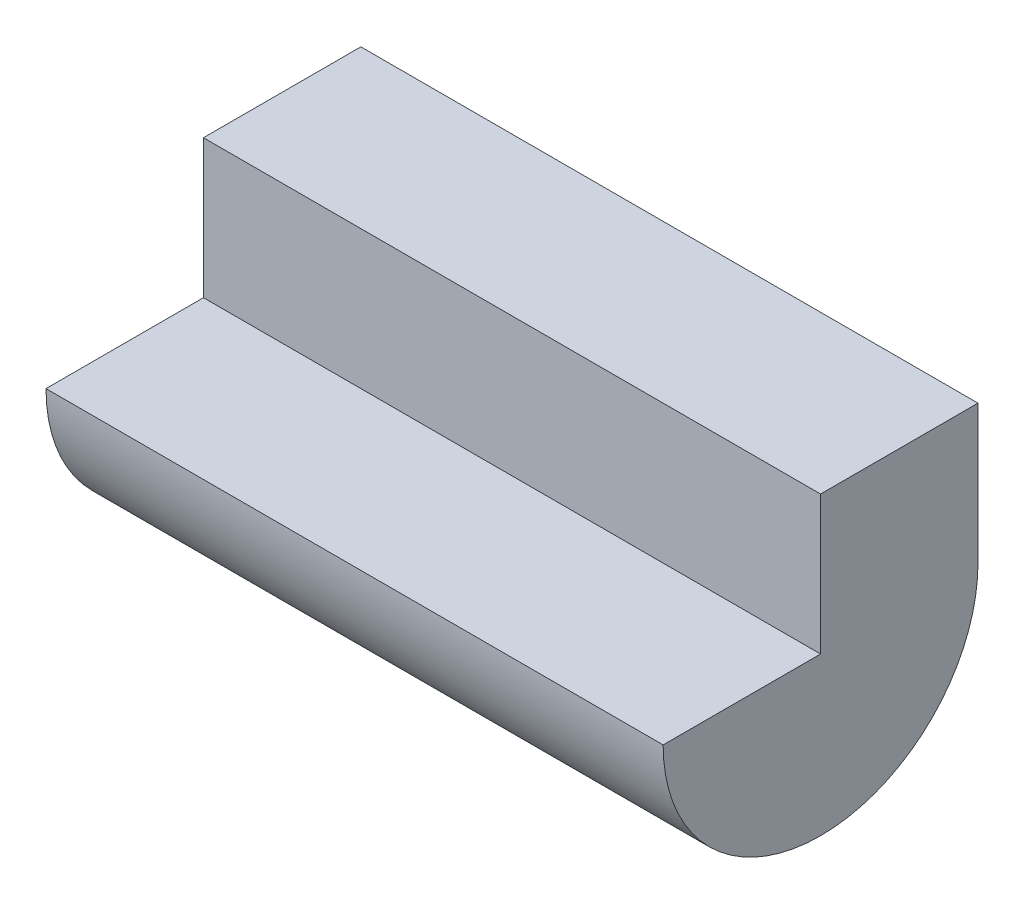
ISO-10303-21;
HEADER;
FILE_DESCRIPTION(('STEP AP214'),'2;1');
FILE_NAME('part.step','',(''),(''),'','','');
FILE_SCHEMA(('AUTOMOTIVE_DESIGN { 1 0 10303 214 1 1 1 1 }'));
ENDSEC;
DATA;
#1=APPLICATION_CONTEXT('core data for automotive mechanical design processes');
#2=APPLICATION_PROTOCOL_DEFINITION('international standard','automotive_design',2000,#1);
#3=PRODUCT_CONTEXT('',#1,'mechanical');
#4=PRODUCT('Part','Part','',(#3));
#5=PRODUCT_RELATED_PRODUCT_CATEGORY('part','',(#4));
#6=PRODUCT_DEFINITION_FORMATION('','',#4);
#7=PRODUCT_DEFINITION_CONTEXT('part definition',#1,'design');
#8=PRODUCT_DEFINITION('design','',#6,#7);
#9=PRODUCT_DEFINITION_SHAPE('','',#8);
#10=(LENGTH_UNIT() NAMED_UNIT(*) SI_UNIT(.MILLI.,.METRE.));
#11=(NAMED_UNIT(*) PLANE_ANGLE_UNIT() SI_UNIT($,.RADIAN.));
#12=(NAMED_UNIT(*) SI_UNIT($,.STERADIAN.) SOLID_ANGLE_UNIT());
#13=UNCERTAINTY_MEASURE_WITH_UNIT(LENGTH_MEASURE(1.E-05),#10,'distance_accuracy_value','');
#14=(GEOMETRIC_REPRESENTATION_CONTEXT(3) GLOBAL_UNCERTAINTY_ASSIGNED_CONTEXT((#13)) GLOBAL_UNIT_ASSIGNED_CONTEXT((#10,
#11,#12)) REPRESENTATION_CONTEXT('',''));
#15=CARTESIAN_POINT('',(0.,0.,0.));
#16=DIRECTION('',(0.,0.,1.));
#17=DIRECTION('',(1.,0.,0.));
#18=AXIS2_PLACEMENT_3D('',#15,#16,#17);
#19=CARTESIAN_POINT('',(-25.9741611328456,-35.,-43.6425632628506));
#20=DIRECTION('',(0.,-1.,0.));
#21=DIRECTION('',(0.,0.,-1.));
#22=AXIS2_PLACEMENT_3D('',#19,#20,#21);
#23=PLANE('',#22);
#24=DIRECTION('',(1.,0.,0.));
#25=VECTOR('',#24,1.);
#26=CARTESIAN_POINT('',(87.2567605886307,-35.,-33.8644263980881));
#27=LINE('',#26,#25);
#28=CARTESIAN_POINT('',(77.4567605886308,-35.,-33.8644263980881));
#29=VERTEX_POINT('',#28);
#30=CARTESIAN_POINT('',(87.2567605886307,-35.,-33.8644263980881));
#31=VERTEX_POINT('',#30);
#32=EDGE_CURVE('E108',#29,#31,#27,.T.);
#33=ORIENTED_EDGE('',*,*,#32,.F.);
#34=DIRECTION('',(0.,0.,-1.));
#35=VECTOR('',#34,1.);
#36=CARTESIAN_POINT('',(77.4567605886308,-35.,-33.8644263980881));
#37=LINE('',#36,#35);
#38=CARTESIAN_POINT('',(77.4567605886307,-35.,-31.3644263980881));
#39=VERTEX_POINT('',#38);
#40=EDGE_CURVE('E94',#39,#29,#37,.T.);
#41=ORIENTED_EDGE('',*,*,#40,.F.);
#42=DIRECTION('',(-1.,0.,0.));
#43=VECTOR('',#42,1.);
#44=CARTESIAN_POINT('',(87.2567605886307,-35.,-31.3644263980881));
#45=LINE('',#44,#43);
#46=CARTESIAN_POINT('',(87.2567605886307,-35.,-31.3644263980881));
#47=VERTEX_POINT('',#46);
#48=EDGE_CURVE('E91',#47,#39,#45,.T.);
#49=ORIENTED_EDGE('',*,*,#48,.F.);
#50=DIRECTION('',(0.,0.,1.));
#51=VECTOR('',#50,1.);
#52=CARTESIAN_POINT('',(87.2567605886307,-35.,-33.8644263980881));
#53=LINE('',#52,#51);
#54=EDGE_CURVE('E80',#31,#47,#53,.T.);
#55=ORIENTED_EDGE('',*,*,#54,.F.);
#56=EDGE_LOOP('',(#33,#41,#49,#55));
#57=FACE_BOUND('',#56,.T.);
#58=ADVANCED_FACE('F33',(#57),#23,.F.);
#59=CARTESIAN_POINT('',(87.2567605886307,-37.2,-31.3644263980881));
#60=DIRECTION('',(0.,0.,-1.));
#61=DIRECTION('',(-1.,0.,0.));
#62=AXIS2_PLACEMENT_3D('',#59,#60,#61);
#63=PLANE('',#62);
#64=ORIENTED_EDGE('',*,*,#48,.T.);
#65=DIRECTION('',(0.,1.,0.));
#66=VECTOR('',#65,1.);
#67=CARTESIAN_POINT('',(77.4567605886307,-37.2,-31.3644263980881));
#68=LINE('',#67,#66);
#69=CARTESIAN_POINT('',(77.4567605886307,-37.2,-31.3644263980881));
#70=VERTEX_POINT('',#69);
#71=EDGE_CURVE('E101',#70,#39,#68,.T.);
#72=ORIENTED_EDGE('',*,*,#71,.F.);
#73=DIRECTION('',(-1.,0.,0.));
#74=VECTOR('',#73,1.);
#75=CARTESIAN_POINT('',(87.2567605886307,-37.2,-31.3644263980881));
#76=LINE('',#75,#74);
#77=CARTESIAN_POINT('',(87.2567605886307,-37.2,-31.3644263980881));
#78=VERTEX_POINT('',#77);
#79=EDGE_CURVE('E100',#78,#70,#76,.T.);
#80=ORIENTED_EDGE('',*,*,#79,.F.);
#81=DIRECTION('',(0.,1.,0.));
#82=VECTOR('',#81,1.);
#83=CARTESIAN_POINT('',(87.2567605886307,-37.2,-31.3644263980881));
#84=LINE('',#83,#82);
#85=EDGE_CURVE('E85',#78,#47,#84,.T.);
#86=ORIENTED_EDGE('',*,*,#85,.T.);
#87=EDGE_LOOP('',(#64,#72,#80,#86));
#88=FACE_BOUND('',#87,.T.);
#89=ADVANCED_FACE('F98',(#88),#63,.F.);
#90=CARTESIAN_POINT('',(0.,-37.2000000000002,-62.7288527961761));
#91=DIRECTION('',(0.,1.,0.));
#92=DIRECTION('',(0.,0.,1.));
#93=AXIS2_PLACEMENT_3D('',#90,#91,#92);
#94=PLANE('',#93);
#95=ORIENTED_EDGE('',*,*,#79,.T.);
#96=DIRECTION('',(0.,0.,1.));
#97=VECTOR('',#96,1.);
#98=CARTESIAN_POINT('',(77.4567605886307,-37.2,-31.364426398088));
#99=LINE('',#98,#97);
#100=CARTESIAN_POINT('',(77.4567605886308,-37.2,-28.864426398088));
#101=VERTEX_POINT('',#100);
#102=EDGE_CURVE('E117',#70,#101,#99,.T.);
#103=ORIENTED_EDGE('',*,*,#102,.T.);
#104=DIRECTION('',(1.,0.,0.));
#105=VECTOR('',#104,1.);
#106=CARTESIAN_POINT('',(77.4567605886308,-37.2,-28.864426398088));
#107=LINE('',#106,#105);
#108=CARTESIAN_POINT('',(87.2567605886307,-37.2,-28.864426398088));
#109=VERTEX_POINT('',#108);
#110=EDGE_CURVE('E11',#101,#109,#107,.T.);
#111=ORIENTED_EDGE('',*,*,#110,.T.);
#112=DIRECTION('',(0.,0.,-1.));
#113=VECTOR('',#112,1.);
#114=CARTESIAN_POINT('',(87.2567605886307,-37.2,-28.864426398088));
#115=LINE('',#114,#113);
#116=EDGE_CURVE('E40',#109,#78,#115,.T.);
#117=ORIENTED_EDGE('',*,*,#116,.T.);
#118=EDGE_LOOP('',(#95,#103,#111,#117));
#119=FACE_BOUND('',#118,.T.);
#120=ADVANCED_FACE('F119',(#119),#94,.T.);
#121=CARTESIAN_POINT('',(77.4567605886308,-37.2,-33.8644263980881));
#122=DIRECTION('',(1.,0.,0.));
#123=DIRECTION('',(0.,0.,-1.));
#124=AXIS2_PLACEMENT_3D('',#121,#122,#123);
#125=PLANE('',#124);
#126=ORIENTED_EDGE('',*,*,#40,.T.);
#127=DIRECTION('',(0.,1.,0.));
#128=VECTOR('',#127,1.);
#129=CARTESIAN_POINT('',(77.4567605886308,-37.2,-33.8644263980881));
#130=LINE('',#129,#128);
#131=CARTESIAN_POINT('',(77.4567605886308,-37.2,-33.8644263980881));
#132=VERTEX_POINT('',#131);
#133=EDGE_CURVE('E103',#132,#29,#130,.T.);
#134=ORIENTED_EDGE('',*,*,#133,.F.);
#135=CARTESIAN_POINT('',(77.4567605886308,-37.2,-31.3644263980881));
#136=DIRECTION('',(1.,0.,0.));
#137=DIRECTION('',(0.,0.,-1.));
#138=AXIS2_PLACEMENT_3D('',#135,#136,#137);
#139=CIRCLE('',#138,2.50000000000002);
#140=EDGE_CURVE('E114',#101,#132,#139,.T.);
#141=ORIENTED_EDGE('',*,*,#140,.F.);
#142=ORIENTED_EDGE('',*,*,#102,.F.);
#143=ORIENTED_EDGE('',*,*,#71,.T.);
#144=EDGE_LOOP('',(#126,#134,#141,#142,#143));
#145=FACE_BOUND('',#144,.T.);
#146=ADVANCED_FACE('F124',(#145),#125,.F.);
#147=CARTESIAN_POINT('',(87.2567605886307,-37.2,-31.3644263980881));
#148=DIRECTION('',(1.,0.,0.));
#149=DIRECTION('',(0.,0.,-1.));
#150=AXIS2_PLACEMENT_3D('',#147,#148,#149);
#151=CYLINDRICAL_SURFACE('',#150,2.50000000000002);
#152=CARTESIAN_POINT('',(87.2567605886307,-37.2,-31.3644263980881));
#153=DIRECTION('',(1.,0.,0.));
#154=DIRECTION('',(0.,0.,-1.));
#155=AXIS2_PLACEMENT_3D('',#152,#153,#154);
#156=CIRCLE('',#155,2.50000000000002);
#157=CARTESIAN_POINT('',(87.2567605886307,-37.2,-33.8644263980881));
#158=VERTEX_POINT('',#157);
#159=EDGE_CURVE('E54',#109,#158,#156,.T.);
#160=ORIENTED_EDGE('',*,*,#159,.F.);
#161=ORIENTED_EDGE('',*,*,#110,.F.);
#162=ORIENTED_EDGE('',*,*,#140,.T.);
#163=DIRECTION('',(1.,0.,0.));
#164=VECTOR('',#163,1.);
#165=CARTESIAN_POINT('',(87.2567605886307,-37.2,-33.8644263980881));
#166=LINE('',#165,#164);
#167=EDGE_CURVE('E47',#132,#158,#166,.T.);
#168=ORIENTED_EDGE('',*,*,#167,.T.);
#169=EDGE_LOOP('',(#160,#161,#162,#168));
#170=FACE_BOUND('',#169,.T.);
#171=ADVANCED_FACE('F121',(#170),#151,.T.);
#172=CARTESIAN_POINT('',(87.2567605886307,-37.2,-33.8644263980881));
#173=DIRECTION('',(-1.,0.,0.));
#174=DIRECTION('',(0.,0.,1.));
#175=AXIS2_PLACEMENT_3D('',#172,#173,#174);
#176=PLANE('',#175);
#177=ORIENTED_EDGE('',*,*,#54,.T.);
#178=ORIENTED_EDGE('',*,*,#85,.F.);
#179=ORIENTED_EDGE('',*,*,#116,.F.);
#180=ORIENTED_EDGE('',*,*,#159,.T.);
#181=DIRECTION('',(0.,1.,0.));
#182=VECTOR('',#181,1.);
#183=CARTESIAN_POINT('',(87.2567605886307,-37.2,-33.8644263980881));
#184=LINE('',#183,#182);
#185=EDGE_CURVE('E87',#158,#31,#184,.T.);
#186=ORIENTED_EDGE('',*,*,#185,.T.);
#187=EDGE_LOOP('',(#177,#178,#179,#180,#186));
#188=FACE_BOUND('',#187,.T.);
#189=ADVANCED_FACE('F82',(#188),#176,.F.);
#190=CARTESIAN_POINT('',(87.2567605886307,-37.2,-33.8644263980881));
#191=DIRECTION('',(0.,0.,1.));
#192=DIRECTION('',(1.,0.,0.));
#193=AXIS2_PLACEMENT_3D('',#190,#191,#192);
#194=PLANE('',#193);
#195=ORIENTED_EDGE('',*,*,#32,.T.);
#196=ORIENTED_EDGE('',*,*,#185,.F.);
#197=ORIENTED_EDGE('',*,*,#167,.F.);
#198=ORIENTED_EDGE('',*,*,#133,.T.);
#199=EDGE_LOOP('',(#195,#196,#197,#198));
#200=FACE_BOUND('',#199,.T.);
#201=ADVANCED_FACE('F125',(#200),#194,.F.);
#202=CLOSED_SHELL('',(#58,#89,#120,#146,#171,#189,#201));
#203=MANIFOLD_SOLID_BREP('B2',#202);
#204=ADVANCED_BREP_SHAPE_REPRESENTATION('',(#18,#203),#14);
#205=SHAPE_DEFINITION_REPRESENTATION(#9,#204);
ENDSEC;
END-ISO-10303-21;
